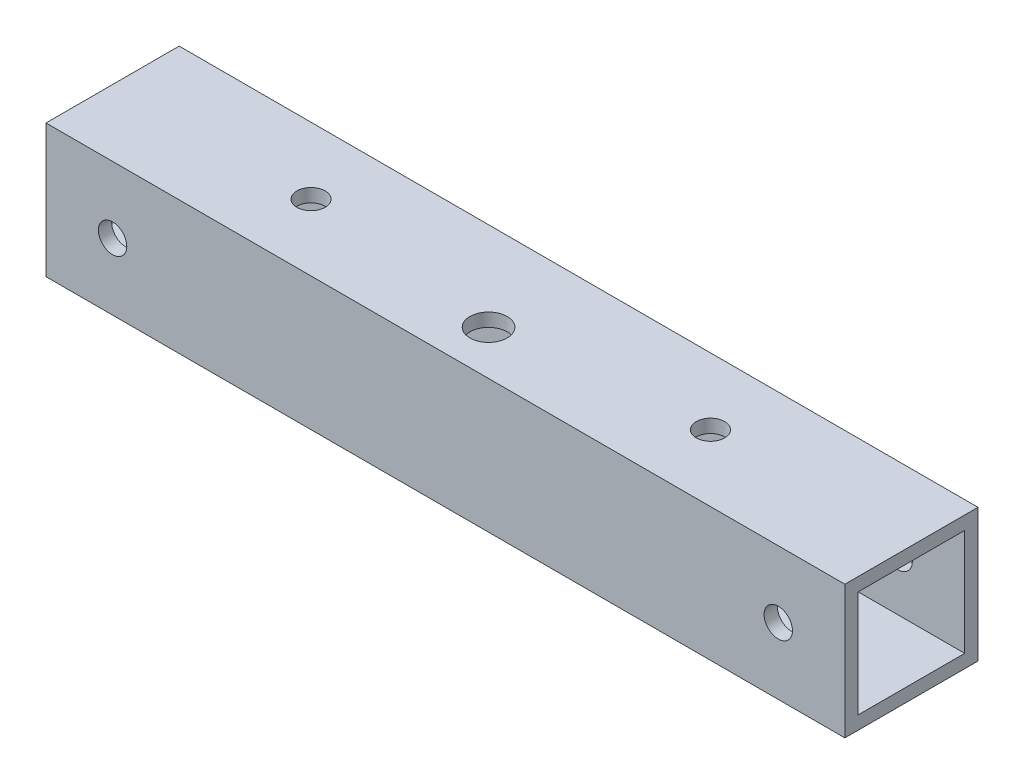
ISO-10303-21;
HEADER;
FILE_DESCRIPTION(('STEP AP214'),'2;1');
FILE_NAME('part.step','',(''),(''),'','','');
FILE_SCHEMA(('AUTOMOTIVE_DESIGN { 1 0 10303 214 1 1 1 1 }'));
ENDSEC;
DATA;
#1=APPLICATION_CONTEXT('core data for automotive mechanical design processes');
#2=APPLICATION_PROTOCOL_DEFINITION('international standard','automotive_design',2000,#1);
#3=PRODUCT_CONTEXT('',#1,'mechanical');
#4=PRODUCT('Part','Part','',(#3));
#5=PRODUCT_RELATED_PRODUCT_CATEGORY('part','',(#4));
#6=PRODUCT_DEFINITION_FORMATION('','',#4);
#7=PRODUCT_DEFINITION_CONTEXT('part definition',#1,'design');
#8=PRODUCT_DEFINITION('design','',#6,#7);
#9=PRODUCT_DEFINITION_SHAPE('','',#8);
#10=(LENGTH_UNIT() NAMED_UNIT(*) SI_UNIT(.MILLI.,.METRE.));
#11=(NAMED_UNIT(*) PLANE_ANGLE_UNIT() SI_UNIT($,.RADIAN.));
#12=(NAMED_UNIT(*) SI_UNIT($,.STERADIAN.) SOLID_ANGLE_UNIT());
#13=UNCERTAINTY_MEASURE_WITH_UNIT(LENGTH_MEASURE(1.E-05),#10,'distance_accuracy_value','');
#14=(GEOMETRIC_REPRESENTATION_CONTEXT(3) GLOBAL_UNCERTAINTY_ASSIGNED_CONTEXT((#13)) GLOBAL_UNIT_ASSIGNED_CONTEXT((#10,
#11,#12)) REPRESENTATION_CONTEXT('',''));
#15=CARTESIAN_POINT('',(0.,0.,0.));
#16=DIRECTION('',(0.,0.,1.));
#17=DIRECTION('',(1.,0.,0.));
#18=AXIS2_PLACEMENT_3D('',#15,#16,#17);
#19=CARTESIAN_POINT('',(90.,0.,0.));
#20=DIRECTION('',(1.,0.,0.));
#21=DIRECTION('',(0.,0.,-1.));
#22=AXIS2_PLACEMENT_3D('',#19,#20,#21);
#23=PLANE('',#22);
#24=DIRECTION('',(0.,1.,0.));
#25=VECTOR('',#24,1.);
#26=CARTESIAN_POINT('',(90.,7.5,-7.5));
#27=LINE('',#26,#25);
#28=CARTESIAN_POINT('',(90.,-7.5,-7.5));
#29=VERTEX_POINT('',#28);
#30=CARTESIAN_POINT('',(90.,7.5,-7.5));
#31=VERTEX_POINT('',#30);
#32=EDGE_CURVE('E144',#29,#31,#27,.T.);
#33=ORIENTED_EDGE('',*,*,#32,.T.);
#34=DIRECTION('',(0.,0.,1.));
#35=VECTOR('',#34,1.);
#36=CARTESIAN_POINT('',(90.,7.5,7.5));
#37=LINE('',#36,#35);
#38=CARTESIAN_POINT('',(90.,7.5,7.5));
#39=VERTEX_POINT('',#38);
#40=EDGE_CURVE('E147',#31,#39,#37,.T.);
#41=ORIENTED_EDGE('',*,*,#40,.T.);
#42=DIRECTION('',(0.,-1.,0.));
#43=VECTOR('',#42,1.);
#44=CARTESIAN_POINT('',(90.,7.5,7.5));
#45=LINE('',#44,#43);
#46=CARTESIAN_POINT('',(90.,-7.5,7.5));
#47=VERTEX_POINT('',#46);
#48=EDGE_CURVE('E150',#39,#47,#45,.T.);
#49=ORIENTED_EDGE('',*,*,#48,.T.);
#50=DIRECTION('',(0.,0.,-1.));
#51=VECTOR('',#50,1.);
#52=CARTESIAN_POINT('',(90.,-7.5,7.5));
#53=LINE('',#52,#51);
#54=EDGE_CURVE('E152',#47,#29,#53,.T.);
#55=ORIENTED_EDGE('',*,*,#54,.T.);
#56=EDGE_LOOP('',(#33,#41,#49,#55));
#57=FACE_BOUND('',#56,.T.);
#58=DIRECTION('',(0.,0.,-1.));
#59=VECTOR('',#58,1.);
#60=CARTESIAN_POINT('',(90.,-6.,6.));
#61=LINE('',#60,#59);
#62=CARTESIAN_POINT('',(90.,-6.,6.));
#63=VERTEX_POINT('',#62);
#64=CARTESIAN_POINT('',(90.,-6.,-6.));
#65=VERTEX_POINT('',#64);
#66=EDGE_CURVE('E114',#63,#65,#61,.T.);
#67=ORIENTED_EDGE('',*,*,#66,.F.);
#68=DIRECTION('',(0.,-1.,0.));
#69=VECTOR('',#68,1.);
#70=CARTESIAN_POINT('',(90.,6.,6.));
#71=LINE('',#70,#69);
#72=CARTESIAN_POINT('',(90.,6.,6.));
#73=VERTEX_POINT('',#72);
#74=EDGE_CURVE('E106',#73,#63,#71,.T.);
#75=ORIENTED_EDGE('',*,*,#74,.F.);
#76=DIRECTION('',(0.,0.,1.));
#77=VECTOR('',#76,1.);
#78=CARTESIAN_POINT('',(90.,6.,6.));
#79=LINE('',#78,#77);
#80=CARTESIAN_POINT('',(90.,6.,-6.));
#81=VERTEX_POINT('',#80);
#82=EDGE_CURVE('E128',#81,#73,#79,.T.);
#83=ORIENTED_EDGE('',*,*,#82,.F.);
#84=DIRECTION('',(0.,1.,0.));
#85=VECTOR('',#84,1.);
#86=CARTESIAN_POINT('',(90.,6.,-6.));
#87=LINE('',#86,#85);
#88=EDGE_CURVE('E126',#65,#81,#87,.T.);
#89=ORIENTED_EDGE('',*,*,#88,.F.);
#90=EDGE_LOOP('',(#67,#75,#83,#89));
#91=FACE_BOUND('',#90,.T.);
#92=ADVANCED_FACE('F39',(#57,#91),#23,.T.);
#93=CARTESIAN_POINT('',(0.,0.,0.));
#94=DIRECTION('',(1.,0.,0.));
#95=DIRECTION('',(0.,0.,-1.));
#96=AXIS2_PLACEMENT_3D('',#93,#94,#95);
#97=PLANE('',#96);
#98=DIRECTION('',(0.,1.,0.));
#99=VECTOR('',#98,1.);
#100=CARTESIAN_POINT('',(0.,7.5,-7.5));
#101=LINE('',#100,#99);
#102=CARTESIAN_POINT('',(0.,-7.5,-7.5));
#103=VERTEX_POINT('',#102);
#104=CARTESIAN_POINT('',(0.,7.5,-7.5));
#105=VERTEX_POINT('',#104);
#106=EDGE_CURVE('E122',#103,#105,#101,.T.);
#107=ORIENTED_EDGE('',*,*,#106,.F.);
#108=DIRECTION('',(0.,0.,-1.));
#109=VECTOR('',#108,1.);
#110=CARTESIAN_POINT('',(0.,-7.5,7.5));
#111=LINE('',#110,#109);
#112=CARTESIAN_POINT('',(0.,-7.5,7.5));
#113=VERTEX_POINT('',#112);
#114=EDGE_CURVE('E148',#113,#103,#111,.T.);
#115=ORIENTED_EDGE('',*,*,#114,.F.);
#116=DIRECTION('',(0.,-1.,0.));
#117=VECTOR('',#116,1.);
#118=CARTESIAN_POINT('',(0.,7.5,7.5));
#119=LINE('',#118,#117);
#120=CARTESIAN_POINT('',(0.,7.5,7.5));
#121=VERTEX_POINT('',#120);
#122=EDGE_CURVE('E159',#121,#113,#119,.T.);
#123=ORIENTED_EDGE('',*,*,#122,.F.);
#124=DIRECTION('',(0.,0.,1.));
#125=VECTOR('',#124,1.);
#126=CARTESIAN_POINT('',(0.,7.5,7.5));
#127=LINE('',#126,#125);
#128=EDGE_CURVE('E157',#105,#121,#127,.T.);
#129=ORIENTED_EDGE('',*,*,#128,.F.);
#130=EDGE_LOOP('',(#107,#115,#123,#129));
#131=FACE_BOUND('',#130,.T.);
#132=DIRECTION('',(0.,-1.,0.));
#133=VECTOR('',#132,1.);
#134=CARTESIAN_POINT('',(0.,6.,6.));
#135=LINE('',#134,#133);
#136=CARTESIAN_POINT('',(0.,6.,6.));
#137=VERTEX_POINT('',#136);
#138=CARTESIAN_POINT('',(0.,-6.,6.));
#139=VERTEX_POINT('',#138);
#140=EDGE_CURVE('E64',#137,#139,#135,.T.);
#141=ORIENTED_EDGE('',*,*,#140,.T.);
#142=DIRECTION('',(0.,0.,-1.));
#143=VECTOR('',#142,1.);
#144=CARTESIAN_POINT('',(0.,-6.,6.));
#145=LINE('',#144,#143);
#146=CARTESIAN_POINT('',(0.,-6.,-6.));
#147=VERTEX_POINT('',#146);
#148=EDGE_CURVE('E121',#139,#147,#145,.T.);
#149=ORIENTED_EDGE('',*,*,#148,.T.);
#150=DIRECTION('',(0.,1.,0.));
#151=VECTOR('',#150,1.);
#152=CARTESIAN_POINT('',(0.,6.,-6.));
#153=LINE('',#152,#151);
#154=CARTESIAN_POINT('',(0.,6.,-6.));
#155=VERTEX_POINT('',#154);
#156=EDGE_CURVE('E136',#147,#155,#153,.T.);
#157=ORIENTED_EDGE('',*,*,#156,.T.);
#158=DIRECTION('',(0.,0.,1.));
#159=VECTOR('',#158,1.);
#160=CARTESIAN_POINT('',(0.,6.,6.));
#161=LINE('',#160,#159);
#162=EDGE_CURVE('E115',#155,#137,#161,.T.);
#163=ORIENTED_EDGE('',*,*,#162,.T.);
#164=EDGE_LOOP('',(#141,#149,#157,#163));
#165=FACE_BOUND('',#164,.T.);
#166=ADVANCED_FACE('F264',(#131,#165),#97,.F.);
#167=CARTESIAN_POINT('',(90.,7.5,-7.5));
#168=DIRECTION('',(0.,0.,1.));
#169=DIRECTION('',(1.,0.,0.));
#170=AXIS2_PLACEMENT_3D('',#167,#168,#169);
#171=PLANE('',#170);
#172=CARTESIAN_POINT('',(7.5,0.,-7.5));
#173=DIRECTION('',(0.,0.,1.));
#174=DIRECTION('',(1.,0.,0.));
#175=AXIS2_PLACEMENT_3D('',#172,#173,#174);
#176=CIRCLE('',#175,1.6);
#177=CARTESIAN_POINT('',(9.1,0.,-7.5));
#178=VERTEX_POINT('',#177);
#179=EDGE_CURVE('E183',#178,#178,#176,.T.);
#180=ORIENTED_EDGE('',*,*,#179,.T.);
#181=EDGE_LOOP('',(#180));
#182=FACE_BOUND('',#181,.T.);
#183=CARTESIAN_POINT('',(82.5,0.,-7.5));
#184=DIRECTION('',(0.,0.,1.));
#185=DIRECTION('',(1.,0.,0.));
#186=AXIS2_PLACEMENT_3D('',#183,#184,#185);
#187=CIRCLE('',#186,1.60000000000001);
#188=CARTESIAN_POINT('',(84.1,0.,-7.5));
#189=VERTEX_POINT('',#188);
#190=EDGE_CURVE('E194',#189,#189,#187,.T.);
#191=ORIENTED_EDGE('',*,*,#190,.T.);
#192=EDGE_LOOP('',(#191));
#193=FACE_BOUND('',#192,.T.);
#194=ORIENTED_EDGE('',*,*,#106,.T.);
#195=DIRECTION('',(-1.,0.,0.));
#196=VECTOR('',#195,1.);
#197=CARTESIAN_POINT('',(90.,7.5,-7.5));
#198=LINE('',#197,#196);
#199=EDGE_CURVE('E11',#31,#105,#198,.T.);
#200=ORIENTED_EDGE('',*,*,#199,.F.);
#201=ORIENTED_EDGE('',*,*,#32,.F.);
#202=DIRECTION('',(-1.,0.,0.));
#203=VECTOR('',#202,1.);
#204=CARTESIAN_POINT('',(90.,-7.5,-7.5));
#205=LINE('',#204,#203);
#206=EDGE_CURVE('E154',#29,#103,#205,.T.);
#207=ORIENTED_EDGE('',*,*,#206,.T.);
#208=EDGE_LOOP('',(#194,#200,#201,#207));
#209=FACE_BOUND('',#208,.T.);
#210=ADVANCED_FACE('F41',(#182,#193,#209),#171,.F.);
#211=CARTESIAN_POINT('',(90.,7.5,7.5));
#212=DIRECTION('',(0.,-1.,0.));
#213=DIRECTION('',(0.,0.,-1.));
#214=AXIS2_PLACEMENT_3D('',#211,#212,#213);
#215=PLANE('',#214);
#216=CARTESIAN_POINT('',(67.3604619558313,7.5,0.));
#217=DIRECTION('',(0.,1.,0.));
#218=DIRECTION('',(0.,0.,1.));
#219=AXIS2_PLACEMENT_3D('',#216,#217,#218);
#220=CIRCLE('',#219,1.60000000000001);
#221=CARTESIAN_POINT('',(67.3604619558313,7.5,1.60000000000001));
#222=VERTEX_POINT('',#221);
#223=EDGE_CURVE('E205',#222,#222,#220,.T.);
#224=ORIENTED_EDGE('',*,*,#223,.F.);
#225=EDGE_LOOP('',(#224));
#226=FACE_BOUND('',#225,.T.);
#227=CARTESIAN_POINT('',(22.3604619558313,7.5,0.));
#228=DIRECTION('',(0.,1.,0.));
#229=DIRECTION('',(0.,0.,1.));
#230=AXIS2_PLACEMENT_3D('',#227,#228,#229);
#231=CIRCLE('',#230,1.6);
#232=CARTESIAN_POINT('',(22.3604619558313,7.5,1.6));
#233=VERTEX_POINT('',#232);
#234=EDGE_CURVE('E210',#233,#233,#231,.T.);
#235=ORIENTED_EDGE('',*,*,#234,.F.);
#236=EDGE_LOOP('',(#235));
#237=FACE_BOUND('',#236,.T.);
#238=CARTESIAN_POINT('',(44.8604619558313,7.5,2.50194746583937));
#239=DIRECTION('',(0.,1.,0.));
#240=DIRECTION('',(0.,0.,1.));
#241=AXIS2_PLACEMENT_3D('',#238,#239,#240);
#242=CIRCLE('',#241,2.1);
#243=CARTESIAN_POINT('',(44.8604619558313,7.5,4.60194746583937));
#244=VERTEX_POINT('',#243);
#245=EDGE_CURVE('E209',#244,#244,#242,.T.);
#246=ORIENTED_EDGE('',*,*,#245,.F.);
#247=EDGE_LOOP('',(#246));
#248=FACE_BOUND('',#247,.T.);
#249=ORIENTED_EDGE('',*,*,#128,.T.);
#250=DIRECTION('',(-1.,0.,0.));
#251=VECTOR('',#250,1.);
#252=CARTESIAN_POINT('',(90.,7.5,7.5));
#253=LINE('',#252,#251);
#254=EDGE_CURVE('E48',#39,#121,#253,.T.);
#255=ORIENTED_EDGE('',*,*,#254,.F.);
#256=ORIENTED_EDGE('',*,*,#40,.F.);
#257=ORIENTED_EDGE('',*,*,#199,.T.);
#258=EDGE_LOOP('',(#249,#255,#256,#257));
#259=FACE_BOUND('',#258,.T.);
#260=ADVANCED_FACE('F268',(#226,#237,#248,#259),#215,.F.);
#261=CARTESIAN_POINT('',(90.,7.5,7.5));
#262=DIRECTION('',(0.,0.,-1.));
#263=DIRECTION('',(-1.,0.,0.));
#264=AXIS2_PLACEMENT_3D('',#261,#262,#263);
#265=PLANE('',#264);
#266=CARTESIAN_POINT('',(7.5,0.,7.5));
#267=DIRECTION('',(0.,0.,1.));
#268=DIRECTION('',(1.,0.,0.));
#269=AXIS2_PLACEMENT_3D('',#266,#267,#268);
#270=CIRCLE('',#269,1.6);
#271=CARTESIAN_POINT('',(9.1,0.,7.5));
#272=VERTEX_POINT('',#271);
#273=EDGE_CURVE('E189',#272,#272,#270,.T.);
#274=ORIENTED_EDGE('',*,*,#273,.F.);
#275=EDGE_LOOP('',(#274));
#276=FACE_BOUND('',#275,.T.);
#277=CARTESIAN_POINT('',(82.5,0.,7.5));
#278=DIRECTION('',(0.,0.,1.));
#279=DIRECTION('',(1.,0.,0.));
#280=AXIS2_PLACEMENT_3D('',#277,#278,#279);
#281=CIRCLE('',#280,1.60000000000001);
#282=CARTESIAN_POINT('',(84.1,0.,7.5));
#283=VERTEX_POINT('',#282);
#284=EDGE_CURVE('E199',#283,#283,#281,.T.);
#285=ORIENTED_EDGE('',*,*,#284,.F.);
#286=EDGE_LOOP('',(#285));
#287=FACE_BOUND('',#286,.T.);
#288=ORIENTED_EDGE('',*,*,#122,.T.);
#289=DIRECTION('',(-1.,0.,0.));
#290=VECTOR('',#289,1.);
#291=CARTESIAN_POINT('',(90.,-7.5,7.5));
#292=LINE('',#291,#290);
#293=EDGE_CURVE('E164',#47,#113,#292,.T.);
#294=ORIENTED_EDGE('',*,*,#293,.F.);
#295=ORIENTED_EDGE('',*,*,#48,.F.);
#296=ORIENTED_EDGE('',*,*,#254,.T.);
#297=EDGE_LOOP('',(#288,#294,#295,#296));
#298=FACE_BOUND('',#297,.T.);
#299=ADVANCED_FACE('F251',(#276,#287,#298),#265,.F.);
#300=CARTESIAN_POINT('',(90.,-7.5,7.5));
#301=DIRECTION('',(0.,1.,0.));
#302=DIRECTION('',(0.,0.,1.));
#303=AXIS2_PLACEMENT_3D('',#300,#301,#302);
#304=PLANE('',#303);
#305=CARTESIAN_POINT('',(67.3604619558313,-7.5,0.));
#306=DIRECTION('',(0.,1.,0.));
#307=DIRECTION('',(0.,0.,1.));
#308=AXIS2_PLACEMENT_3D('',#305,#306,#307);
#309=CIRCLE('',#308,1.60000000000001);
#310=CARTESIAN_POINT('',(67.3604619558313,-7.5,1.60000000000001));
#311=VERTEX_POINT('',#310);
#312=EDGE_CURVE('E213',#311,#311,#309,.T.);
#313=ORIENTED_EDGE('',*,*,#312,.T.);
#314=EDGE_LOOP('',(#313));
#315=FACE_BOUND('',#314,.T.);
#316=CARTESIAN_POINT('',(22.3604619558313,-7.5,0.));
#317=DIRECTION('',(0.,1.,0.));
#318=DIRECTION('',(0.,0.,1.));
#319=AXIS2_PLACEMENT_3D('',#316,#317,#318);
#320=CIRCLE('',#319,1.6);
#321=CARTESIAN_POINT('',(22.3604619558313,-7.5,1.6));
#322=VERTEX_POINT('',#321);
#323=EDGE_CURVE('E206',#322,#322,#320,.T.);
#324=ORIENTED_EDGE('',*,*,#323,.T.);
#325=EDGE_LOOP('',(#324));
#326=FACE_BOUND('',#325,.T.);
#327=CARTESIAN_POINT('',(44.8604619558313,-7.5,2.50194746583937));
#328=DIRECTION('',(0.,1.,0.));
#329=DIRECTION('',(0.,0.,1.));
#330=AXIS2_PLACEMENT_3D('',#327,#328,#329);
#331=CIRCLE('',#330,2.1);
#332=CARTESIAN_POINT('',(44.8604619558313,-7.5,4.60194746583937));
#333=VERTEX_POINT('',#332);
#334=EDGE_CURVE('E173',#333,#333,#331,.T.);
#335=ORIENTED_EDGE('',*,*,#334,.T.);
#336=EDGE_LOOP('',(#335));
#337=FACE_BOUND('',#336,.T.);
#338=ORIENTED_EDGE('',*,*,#114,.T.);
#339=ORIENTED_EDGE('',*,*,#206,.F.);
#340=ORIENTED_EDGE('',*,*,#54,.F.);
#341=ORIENTED_EDGE('',*,*,#293,.T.);
#342=EDGE_LOOP('',(#338,#339,#340,#341));
#343=FACE_BOUND('',#342,.T.);
#344=ADVANCED_FACE('F248',(#315,#326,#337,#343),#304,.F.);
#345=CARTESIAN_POINT('',(90.,6.,6.));
#346=DIRECTION('',(0.,0.,-1.));
#347=DIRECTION('',(0.,1.,0.));
#348=AXIS2_PLACEMENT_3D('',#345,#346,#347);
#349=PLANE('',#348);
#350=CARTESIAN_POINT('',(7.5,0.,6.));
#351=DIRECTION('',(0.,0.,-1.));
#352=DIRECTION('',(0.,1.,0.));
#353=AXIS2_PLACEMENT_3D('',#350,#351,#352);
#354=CIRCLE('',#353,1.6);
#355=CARTESIAN_POINT('',(7.5,1.6,6.));
#356=VERTEX_POINT('',#355);
#357=EDGE_CURVE('E202',#356,#356,#354,.T.);
#358=ORIENTED_EDGE('',*,*,#357,.F.);
#359=EDGE_LOOP('',(#358));
#360=FACE_BOUND('',#359,.T.);
#361=CARTESIAN_POINT('',(82.5,0.,6.));
#362=DIRECTION('',(0.,0.,-1.));
#363=DIRECTION('',(0.,1.,0.));
#364=AXIS2_PLACEMENT_3D('',#361,#362,#363);
#365=CIRCLE('',#364,1.60000000000001);
#366=CARTESIAN_POINT('',(82.5,1.60000000000001,6.));
#367=VERTEX_POINT('',#366);
#368=EDGE_CURVE('E182',#367,#367,#365,.T.);
#369=ORIENTED_EDGE('',*,*,#368,.F.);
#370=EDGE_LOOP('',(#369));
#371=FACE_BOUND('',#370,.T.);
#372=ORIENTED_EDGE('',*,*,#140,.F.);
#373=DIRECTION('',(-1.,0.,0.));
#374=VECTOR('',#373,1.);
#375=CARTESIAN_POINT('',(90.,6.,6.));
#376=LINE('',#375,#374);
#377=EDGE_CURVE('E110',#73,#137,#376,.T.);
#378=ORIENTED_EDGE('',*,*,#377,.F.);
#379=ORIENTED_EDGE('',*,*,#74,.T.);
#380=DIRECTION('',(-1.,0.,0.));
#381=VECTOR('',#380,1.);
#382=CARTESIAN_POINT('',(90.,-6.,6.));
#383=LINE('',#382,#381);
#384=EDGE_CURVE('E109',#63,#139,#383,.T.);
#385=ORIENTED_EDGE('',*,*,#384,.T.);
#386=EDGE_LOOP('',(#372,#378,#379,#385));
#387=FACE_BOUND('',#386,.T.);
#388=ADVANCED_FACE('F108',(#360,#371,#387),#349,.T.);
#389=CARTESIAN_POINT('',(90.,-6.,6.));
#390=DIRECTION('',(0.,1.,0.));
#391=DIRECTION('',(0.,0.,1.));
#392=AXIS2_PLACEMENT_3D('',#389,#390,#391);
#393=PLANE('',#392);
#394=CARTESIAN_POINT('',(67.3604619558313,-6.,0.));
#395=DIRECTION('',(0.,1.,0.));
#396=DIRECTION('',(0.,0.,1.));
#397=AXIS2_PLACEMENT_3D('',#394,#395,#396);
#398=CIRCLE('',#397,1.60000000000001);
#399=CARTESIAN_POINT('',(67.3604619558313,-6.,1.60000000000001));
#400=VERTEX_POINT('',#399);
#401=EDGE_CURVE('E134',#400,#400,#398,.T.);
#402=ORIENTED_EDGE('',*,*,#401,.F.);
#403=EDGE_LOOP('',(#402));
#404=FACE_BOUND('',#403,.T.);
#405=CARTESIAN_POINT('',(22.3604619558313,-6.,0.));
#406=DIRECTION('',(0.,1.,0.));
#407=DIRECTION('',(0.,0.,1.));
#408=AXIS2_PLACEMENT_3D('',#405,#406,#407);
#409=CIRCLE('',#408,1.6);
#410=CARTESIAN_POINT('',(22.3604619558313,-6.,1.6));
#411=VERTEX_POINT('',#410);
#412=EDGE_CURVE('E177',#411,#411,#409,.T.);
#413=ORIENTED_EDGE('',*,*,#412,.F.);
#414=EDGE_LOOP('',(#413));
#415=FACE_BOUND('',#414,.T.);
#416=CARTESIAN_POINT('',(44.8604619558313,-6.,2.50194746583937));
#417=DIRECTION('',(0.,1.,0.));
#418=DIRECTION('',(0.,0.,1.));
#419=AXIS2_PLACEMENT_3D('',#416,#417,#418);
#420=CIRCLE('',#419,2.1);
#421=CARTESIAN_POINT('',(44.8604619558313,-6.,4.60194746583937));
#422=VERTEX_POINT('',#421);
#423=EDGE_CURVE('E172',#422,#422,#420,.T.);
#424=ORIENTED_EDGE('',*,*,#423,.F.);
#425=EDGE_LOOP('',(#424));
#426=FACE_BOUND('',#425,.T.);
#427=ORIENTED_EDGE('',*,*,#148,.F.);
#428=ORIENTED_EDGE('',*,*,#384,.F.);
#429=ORIENTED_EDGE('',*,*,#66,.T.);
#430=DIRECTION('',(-1.,0.,0.));
#431=VECTOR('',#430,1.);
#432=CARTESIAN_POINT('',(90.,-6.,-6.));
#433=LINE('',#432,#431);
#434=EDGE_CURVE('E123',#65,#147,#433,.T.);
#435=ORIENTED_EDGE('',*,*,#434,.T.);
#436=EDGE_LOOP('',(#427,#428,#429,#435));
#437=FACE_BOUND('',#436,.T.);
#438=ADVANCED_FACE('F118',(#404,#415,#426,#437),#393,.T.);
#439=CARTESIAN_POINT('',(90.,6.,-6.));
#440=DIRECTION('',(0.,0.,1.));
#441=DIRECTION('',(1.,0.,0.));
#442=AXIS2_PLACEMENT_3D('',#439,#440,#441);
#443=PLANE('',#442);
#444=CARTESIAN_POINT('',(7.5,0.,-6.));
#445=DIRECTION('',(0.,0.,1.));
#446=DIRECTION('',(1.,0.,0.));
#447=AXIS2_PLACEMENT_3D('',#444,#445,#446);
#448=CIRCLE('',#447,1.6);
#449=CARTESIAN_POINT('',(9.1,0.,-6.));
#450=VERTEX_POINT('',#449);
#451=EDGE_CURVE('E43',#450,#450,#448,.T.);
#452=ORIENTED_EDGE('',*,*,#451,.F.);
#453=EDGE_LOOP('',(#452));
#454=FACE_BOUND('',#453,.T.);
#455=CARTESIAN_POINT('',(82.5,0.,-6.));
#456=DIRECTION('',(0.,0.,1.));
#457=DIRECTION('',(1.,0.,0.));
#458=AXIS2_PLACEMENT_3D('',#455,#456,#457);
#459=CIRCLE('',#458,1.60000000000001);
#460=CARTESIAN_POINT('',(84.1,0.,-6.));
#461=VERTEX_POINT('',#460);
#462=EDGE_CURVE('E180',#461,#461,#459,.T.);
#463=ORIENTED_EDGE('',*,*,#462,.F.);
#464=EDGE_LOOP('',(#463));
#465=FACE_BOUND('',#464,.T.);
#466=ORIENTED_EDGE('',*,*,#156,.F.);
#467=ORIENTED_EDGE('',*,*,#434,.F.);
#468=ORIENTED_EDGE('',*,*,#88,.T.);
#469=DIRECTION('',(-1.,0.,0.));
#470=VECTOR('',#469,1.);
#471=CARTESIAN_POINT('',(90.,6.,-6.));
#472=LINE('',#471,#470);
#473=EDGE_CURVE('E56',#81,#155,#472,.T.);
#474=ORIENTED_EDGE('',*,*,#473,.T.);
#475=EDGE_LOOP('',(#466,#467,#468,#474));
#476=FACE_BOUND('',#475,.T.);
#477=ADVANCED_FACE('F233',(#454,#465,#476),#443,.T.);
#478=CARTESIAN_POINT('',(90.,6.,6.));
#479=DIRECTION('',(0.,-1.,0.));
#480=DIRECTION('',(0.,0.,-1.));
#481=AXIS2_PLACEMENT_3D('',#478,#479,#480);
#482=PLANE('',#481);
#483=CARTESIAN_POINT('',(67.3604619558313,6.,0.));
#484=DIRECTION('',(0.,-1.,0.));
#485=DIRECTION('',(0.,0.,-1.));
#486=AXIS2_PLACEMENT_3D('',#483,#484,#485);
#487=CIRCLE('',#486,1.60000000000001);
#488=CARTESIAN_POINT('',(67.3604619558313,6.,-1.60000000000001));
#489=VERTEX_POINT('',#488);
#490=EDGE_CURVE('E178',#489,#489,#487,.T.);
#491=ORIENTED_EDGE('',*,*,#490,.F.);
#492=EDGE_LOOP('',(#491));
#493=FACE_BOUND('',#492,.T.);
#494=CARTESIAN_POINT('',(22.3604619558313,6.,0.));
#495=DIRECTION('',(0.,-1.,0.));
#496=DIRECTION('',(0.,0.,-1.));
#497=AXIS2_PLACEMENT_3D('',#494,#495,#496);
#498=CIRCLE('',#497,1.6);
#499=CARTESIAN_POINT('',(22.3604619558313,6.,-1.6));
#500=VERTEX_POINT('',#499);
#501=EDGE_CURVE('E174',#500,#500,#498,.T.);
#502=ORIENTED_EDGE('',*,*,#501,.F.);
#503=EDGE_LOOP('',(#502));
#504=FACE_BOUND('',#503,.T.);
#505=CARTESIAN_POINT('',(44.8604619558313,6.,2.50194746583937));
#506=DIRECTION('',(0.,-1.,0.));
#507=DIRECTION('',(0.,0.,-1.));
#508=AXIS2_PLACEMENT_3D('',#505,#506,#507);
#509=CIRCLE('',#508,2.1);
#510=CARTESIAN_POINT('',(44.8604619558313,6.,0.401947465839373));
#511=VERTEX_POINT('',#510);
#512=EDGE_CURVE('E169',#511,#511,#509,.T.);
#513=ORIENTED_EDGE('',*,*,#512,.F.);
#514=EDGE_LOOP('',(#513));
#515=FACE_BOUND('',#514,.T.);
#516=ORIENTED_EDGE('',*,*,#162,.F.);
#517=ORIENTED_EDGE('',*,*,#473,.F.);
#518=ORIENTED_EDGE('',*,*,#82,.T.);
#519=ORIENTED_EDGE('',*,*,#377,.T.);
#520=EDGE_LOOP('',(#516,#517,#518,#519));
#521=FACE_BOUND('',#520,.T.);
#522=ADVANCED_FACE('F293',(#493,#504,#515,#521),#482,.T.);
#523=CARTESIAN_POINT('',(44.8604619558313,-7.5,2.50194746583937));
#524=DIRECTION('',(0.,1.,0.));
#525=DIRECTION('',(0.,0.,1.));
#526=AXIS2_PLACEMENT_3D('',#523,#524,#525);
#527=CYLINDRICAL_SURFACE('',#526,2.1);
#528=ORIENTED_EDGE('',*,*,#512,.T.);
#529=EDGE_LOOP('',(#528));
#530=FACE_BOUND('',#529,.T.);
#531=ORIENTED_EDGE('',*,*,#245,.T.);
#532=EDGE_LOOP('',(#531));
#533=FACE_BOUND('',#532,.T.);
#534=ADVANCED_FACE('F245',(#530,#533),#527,.F.);
#535=CARTESIAN_POINT('',(22.3604619558313,-7.5,0.));
#536=DIRECTION('',(0.,1.,0.));
#537=DIRECTION('',(0.,0.,1.));
#538=AXIS2_PLACEMENT_3D('',#535,#536,#537);
#539=CYLINDRICAL_SURFACE('',#538,1.6);
#540=ORIENTED_EDGE('',*,*,#501,.T.);
#541=EDGE_LOOP('',(#540));
#542=FACE_BOUND('',#541,.T.);
#543=ORIENTED_EDGE('',*,*,#234,.T.);
#544=EDGE_LOOP('',(#543));
#545=FACE_BOUND('',#544,.T.);
#546=ADVANCED_FACE('F299',(#542,#545),#539,.F.);
#547=CARTESIAN_POINT('',(67.3604619558313,-7.5,0.));
#548=DIRECTION('',(0.,1.,0.));
#549=DIRECTION('',(0.,0.,1.));
#550=AXIS2_PLACEMENT_3D('',#547,#548,#549);
#551=CYLINDRICAL_SURFACE('',#550,1.60000000000001);
#552=ORIENTED_EDGE('',*,*,#490,.T.);
#553=EDGE_LOOP('',(#552));
#554=FACE_BOUND('',#553,.T.);
#555=ORIENTED_EDGE('',*,*,#223,.T.);
#556=EDGE_LOOP('',(#555));
#557=FACE_BOUND('',#556,.T.);
#558=ADVANCED_FACE('F243',(#554,#557),#551,.F.);
#559=ORIENTED_EDGE('',*,*,#423,.T.);
#560=EDGE_LOOP('',(#559));
#561=FACE_BOUND('',#560,.T.);
#562=ORIENTED_EDGE('',*,*,#334,.F.);
#563=EDGE_LOOP('',(#562));
#564=FACE_BOUND('',#563,.T.);
#565=ADVANCED_FACE('F239',(#561,#564),#527,.F.);
#566=ORIENTED_EDGE('',*,*,#412,.T.);
#567=EDGE_LOOP('',(#566));
#568=FACE_BOUND('',#567,.T.);
#569=ORIENTED_EDGE('',*,*,#323,.F.);
#570=EDGE_LOOP('',(#569));
#571=FACE_BOUND('',#570,.T.);
#572=ADVANCED_FACE('F242',(#568,#571),#539,.F.);
#573=ORIENTED_EDGE('',*,*,#401,.T.);
#574=EDGE_LOOP('',(#573));
#575=FACE_BOUND('',#574,.T.);
#576=ORIENTED_EDGE('',*,*,#312,.F.);
#577=EDGE_LOOP('',(#576));
#578=FACE_BOUND('',#577,.T.);
#579=ADVANCED_FACE('F228',(#575,#578),#551,.F.);
#580=CARTESIAN_POINT('',(82.5,0.,-7.5));
#581=DIRECTION('',(0.,0.,1.));
#582=DIRECTION('',(1.,0.,0.));
#583=AXIS2_PLACEMENT_3D('',#580,#581,#582);
#584=CYLINDRICAL_SURFACE('',#583,1.60000000000001);
#585=ORIENTED_EDGE('',*,*,#462,.T.);
#586=EDGE_LOOP('',(#585));
#587=FACE_BOUND('',#586,.T.);
#588=ORIENTED_EDGE('',*,*,#190,.F.);
#589=EDGE_LOOP('',(#588));
#590=FACE_BOUND('',#589,.T.);
#591=ADVANCED_FACE('F307',(#587,#590),#584,.F.);
#592=CARTESIAN_POINT('',(7.5,0.,-7.5));
#593=DIRECTION('',(0.,0.,1.));
#594=DIRECTION('',(1.,0.,0.));
#595=AXIS2_PLACEMENT_3D('',#592,#593,#594);
#596=CYLINDRICAL_SURFACE('',#595,1.6);
#597=ORIENTED_EDGE('',*,*,#451,.T.);
#598=EDGE_LOOP('',(#597));
#599=FACE_BOUND('',#598,.T.);
#600=ORIENTED_EDGE('',*,*,#179,.F.);
#601=EDGE_LOOP('',(#600));
#602=FACE_BOUND('',#601,.T.);
#603=ADVANCED_FACE('F310',(#599,#602),#596,.F.);
#604=ORIENTED_EDGE('',*,*,#368,.T.);
#605=EDGE_LOOP('',(#604));
#606=FACE_BOUND('',#605,.T.);
#607=ORIENTED_EDGE('',*,*,#284,.T.);
#608=EDGE_LOOP('',(#607));
#609=FACE_BOUND('',#608,.T.);
#610=ADVANCED_FACE('F311',(#606,#609),#584,.F.);
#611=ORIENTED_EDGE('',*,*,#357,.T.);
#612=EDGE_LOOP('',(#611));
#613=FACE_BOUND('',#612,.T.);
#614=ORIENTED_EDGE('',*,*,#273,.T.);
#615=EDGE_LOOP('',(#614));
#616=FACE_BOUND('',#615,.T.);
#617=ADVANCED_FACE('F314',(#613,#616),#596,.F.);
#618=CLOSED_SHELL('',(#92,#166,#210,#260,#299,#344,#388,#438,#477,#522,#534,#546,#558,#565,#572,
#579,#591,#603,#610,#617));
#619=MANIFOLD_SOLID_BREP('B2',#618);
#620=ADVANCED_BREP_SHAPE_REPRESENTATION('',(#18,#619),#14);
#621=SHAPE_DEFINITION_REPRESENTATION(#9,#620);
ENDSEC;
END-ISO-10303-21;
